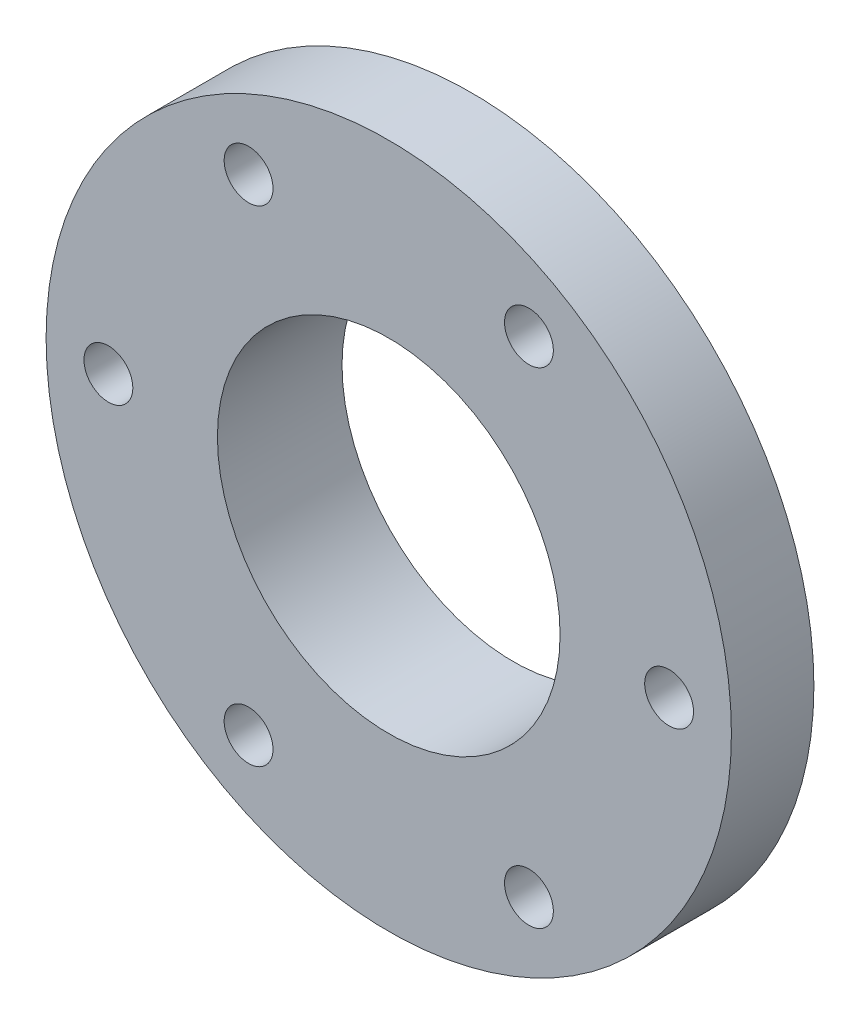
ISO-10303-21;
HEADER;
FILE_DESCRIPTION(('STEP AP214'),'2;1');
FILE_NAME('part.step','',(''),(''),'','','');
FILE_SCHEMA(('AUTOMOTIVE_DESIGN { 1 0 10303 214 1 1 1 1 }'));
ENDSEC;
DATA;
#1=APPLICATION_CONTEXT('core data for automotive mechanical design processes');
#2=APPLICATION_PROTOCOL_DEFINITION('international standard','automotive_design',2000,#1);
#3=PRODUCT_CONTEXT('',#1,'mechanical');
#4=PRODUCT('Part','Part','',(#3));
#5=PRODUCT_RELATED_PRODUCT_CATEGORY('part','',(#4));
#6=PRODUCT_DEFINITION_FORMATION('','',#4);
#7=PRODUCT_DEFINITION_CONTEXT('part definition',#1,'design');
#8=PRODUCT_DEFINITION('design','',#6,#7);
#9=PRODUCT_DEFINITION_SHAPE('','',#8);
#10=(LENGTH_UNIT() NAMED_UNIT(*) SI_UNIT(.MILLI.,.METRE.));
#11=(NAMED_UNIT(*) PLANE_ANGLE_UNIT() SI_UNIT($,.RADIAN.));
#12=(NAMED_UNIT(*) SI_UNIT($,.STERADIAN.) SOLID_ANGLE_UNIT());
#13=UNCERTAINTY_MEASURE_WITH_UNIT(LENGTH_MEASURE(1.E-05),#10,'distance_accuracy_value','');
#14=(GEOMETRIC_REPRESENTATION_CONTEXT(3) GLOBAL_UNCERTAINTY_ASSIGNED_CONTEXT((#13)) GLOBAL_UNIT_ASSIGNED_CONTEXT((#10,
#11,#12)) REPRESENTATION_CONTEXT('',''));
#15=CARTESIAN_POINT('',(0.,0.,0.));
#16=DIRECTION('',(0.,0.,1.));
#17=DIRECTION('',(1.,0.,0.));
#18=AXIS2_PLACEMENT_3D('',#15,#16,#17);
#19=CARTESIAN_POINT('',(0.,0.,-4.2037));
#20=DIRECTION('',(0.,0.,1.));
#21=DIRECTION('',(1.,0.,0.));
#22=AXIS2_PLACEMENT_3D('',#19,#20,#21);
#23=PLANE('',#22);
#24=CARTESIAN_POINT('',(14.2875,-24.7466759131404,-4.2037));
#25=DIRECTION('',(0.,0.,1.));
#26=DIRECTION('',(1.,0.,0.));
#27=AXIS2_PLACEMENT_3D('',#24,#25,#26);
#28=CIRCLE('',#27,2.4892);
#29=CARTESIAN_POINT('',(16.7767,-24.7466759131404,-4.2037));
#30=VERTEX_POINT('',#29);
#31=EDGE_CURVE('E83',#30,#30,#28,.T.);
#32=ORIENTED_EDGE('',*,*,#31,.T.);
#33=EDGE_LOOP('',(#32));
#34=FACE_BOUND('',#33,.T.);
#35=CARTESIAN_POINT('',(28.575,0.,-4.2037));
#36=DIRECTION('',(0.,0.,1.));
#37=DIRECTION('',(1.,0.,0.));
#38=AXIS2_PLACEMENT_3D('',#35,#36,#37);
#39=CIRCLE('',#38,2.4892);
#40=CARTESIAN_POINT('',(31.0642,0.,-4.2037));
#41=VERTEX_POINT('',#40);
#42=EDGE_CURVE('E77',#41,#41,#39,.T.);
#43=ORIENTED_EDGE('',*,*,#42,.T.);
#44=EDGE_LOOP('',(#43));
#45=FACE_BOUND('',#44,.T.);
#46=CARTESIAN_POINT('',(14.2875,24.7466759131403,-4.2037));
#47=DIRECTION('',(0.,0.,1.));
#48=DIRECTION('',(1.,0.,0.));
#49=AXIS2_PLACEMENT_3D('',#46,#47,#48);
#50=CIRCLE('',#49,2.4892);
#51=CARTESIAN_POINT('',(16.7767,24.7466759131403,-4.2037));
#52=VERTEX_POINT('',#51);
#53=EDGE_CURVE('E71',#52,#52,#50,.T.);
#54=ORIENTED_EDGE('',*,*,#53,.T.);
#55=EDGE_LOOP('',(#54));
#56=FACE_BOUND('',#55,.T.);
#57=CARTESIAN_POINT('',(-14.2875,24.7466759131403,-4.2037));
#58=DIRECTION('',(0.,0.,1.));
#59=DIRECTION('',(1.,0.,0.));
#60=AXIS2_PLACEMENT_3D('',#57,#58,#59);
#61=CIRCLE('',#60,2.4892);
#62=CARTESIAN_POINT('',(-11.7983,24.7466759131403,-4.2037));
#63=VERTEX_POINT('',#62);
#64=EDGE_CURVE('E65',#63,#63,#61,.T.);
#65=ORIENTED_EDGE('',*,*,#64,.T.);
#66=EDGE_LOOP('',(#65));
#67=FACE_BOUND('',#66,.T.);
#68=CARTESIAN_POINT('',(-28.575,0.,-4.2037));
#69=DIRECTION('',(0.,0.,1.));
#70=DIRECTION('',(1.,0.,0.));
#71=AXIS2_PLACEMENT_3D('',#68,#69,#70);
#72=CIRCLE('',#71,2.4892);
#73=CARTESIAN_POINT('',(-26.0858,0.,-4.2037));
#74=VERTEX_POINT('',#73);
#75=EDGE_CURVE('E59',#74,#74,#72,.T.);
#76=ORIENTED_EDGE('',*,*,#75,.T.);
#77=EDGE_LOOP('',(#76));
#78=FACE_BOUND('',#77,.T.);
#79=CARTESIAN_POINT('',(-14.2875,-24.7466759131403,-4.2037));
#80=DIRECTION('',(0.,0.,1.));
#81=DIRECTION('',(1.,0.,0.));
#82=AXIS2_PLACEMENT_3D('',#79,#80,#81);
#83=CIRCLE('',#82,2.4892);
#84=CARTESIAN_POINT('',(-11.7983,-24.7466759131403,-4.2037));
#85=VERTEX_POINT('',#84);
#86=EDGE_CURVE('E53',#85,#85,#83,.T.);
#87=ORIENTED_EDGE('',*,*,#86,.T.);
#88=EDGE_LOOP('',(#87));
#89=FACE_BOUND('',#88,.T.);
#90=CARTESIAN_POINT('',(0.,0.,-4.2037));
#91=DIRECTION('',(0.,0.,1.));
#92=DIRECTION('',(1.,0.,0.));
#93=AXIS2_PLACEMENT_3D('',#90,#91,#92);
#94=CIRCLE('',#93,34.925);
#95=CARTESIAN_POINT('',(34.925,0.,-4.2037));
#96=VERTEX_POINT('',#95);
#97=EDGE_CURVE('E43',#96,#96,#94,.T.);
#98=ORIENTED_EDGE('',*,*,#97,.F.);
#99=EDGE_LOOP('',(#98));
#100=FACE_BOUND('',#99,.T.);
#101=CARTESIAN_POINT('',(0.,0.,-4.2037));
#102=DIRECTION('',(0.,0.,1.));
#103=DIRECTION('',(1.,0.,0.));
#104=AXIS2_PLACEMENT_3D('',#101,#102,#103);
#105=CIRCLE('',#104,23.8125);
#106=CARTESIAN_POINT('',(23.8125,0.,-4.2037));
#107=VERTEX_POINT('',#106);
#108=EDGE_CURVE('E10',#107,#107,#105,.F.);
#109=ORIENTED_EDGE('',*,*,#108,.F.);
#110=EDGE_LOOP('',(#109));
#111=FACE_BOUND('',#110,.T.);
#112=ADVANCED_FACE('F32',(#34,#45,#56,#67,#78,#89,#100,#111),#23,.F.);
#113=CARTESIAN_POINT('',(0.,0.,4.2037));
#114=DIRECTION('',(0.,0.,1.));
#115=DIRECTION('',(1.,0.,0.));
#116=AXIS2_PLACEMENT_3D('',#113,#114,#115);
#117=PLANE('',#116);
#118=CARTESIAN_POINT('',(0.,0.,4.2037));
#119=DIRECTION('',(0.,0.,1.));
#120=DIRECTION('',(1.,0.,0.));
#121=AXIS2_PLACEMENT_3D('',#118,#119,#120);
#122=CIRCLE('',#121,17.4625);
#123=CARTESIAN_POINT('',(17.4625,0.,4.2037));
#124=VERTEX_POINT('',#123);
#125=EDGE_CURVE('E48',#124,#124,#122,.T.);
#126=ORIENTED_EDGE('',*,*,#125,.F.);
#127=EDGE_LOOP('',(#126));
#128=FACE_BOUND('',#127,.T.);
#129=CARTESIAN_POINT('',(14.2875,-24.7466759131404,4.2037));
#130=DIRECTION('',(0.,0.,1.));
#131=DIRECTION('',(1.,0.,0.));
#132=AXIS2_PLACEMENT_3D('',#129,#130,#131);
#133=CIRCLE('',#132,2.4892);
#134=CARTESIAN_POINT('',(16.7767,-24.7466759131404,4.2037));
#135=VERTEX_POINT('',#134);
#136=EDGE_CURVE('E80',#135,#135,#133,.T.);
#137=ORIENTED_EDGE('',*,*,#136,.F.);
#138=EDGE_LOOP('',(#137));
#139=FACE_BOUND('',#138,.T.);
#140=CARTESIAN_POINT('',(14.2875,24.7466759131403,4.2037));
#141=DIRECTION('',(0.,0.,1.));
#142=DIRECTION('',(1.,0.,0.));
#143=AXIS2_PLACEMENT_3D('',#140,#141,#142);
#144=CIRCLE('',#143,2.4892);
#145=CARTESIAN_POINT('',(16.7767,24.7466759131403,4.2037));
#146=VERTEX_POINT('',#145);
#147=EDGE_CURVE('E68',#146,#146,#144,.T.);
#148=ORIENTED_EDGE('',*,*,#147,.F.);
#149=EDGE_LOOP('',(#148));
#150=FACE_BOUND('',#149,.T.);
#151=CARTESIAN_POINT('',(-28.575,0.,4.2037));
#152=DIRECTION('',(0.,0.,1.));
#153=DIRECTION('',(1.,0.,0.));
#154=AXIS2_PLACEMENT_3D('',#151,#152,#153);
#155=CIRCLE('',#154,2.4892);
#156=CARTESIAN_POINT('',(-26.0858,0.,4.2037));
#157=VERTEX_POINT('',#156);
#158=EDGE_CURVE('E56',#157,#157,#155,.T.);
#159=ORIENTED_EDGE('',*,*,#158,.F.);
#160=EDGE_LOOP('',(#159));
#161=FACE_BOUND('',#160,.T.);
#162=CARTESIAN_POINT('',(0.,0.,4.2037));
#163=DIRECTION('',(0.,0.,1.));
#164=DIRECTION('',(1.,0.,0.));
#165=AXIS2_PLACEMENT_3D('',#162,#163,#164);
#166=CIRCLE('',#165,34.925);
#167=CARTESIAN_POINT('',(34.925,0.,4.2037));
#168=VERTEX_POINT('',#167);
#169=EDGE_CURVE('E39',#168,#168,#166,.T.);
#170=ORIENTED_EDGE('',*,*,#169,.T.);
#171=EDGE_LOOP('',(#170));
#172=FACE_BOUND('',#171,.T.);
#173=CARTESIAN_POINT('',(-14.2875,-24.7466759131403,4.2037));
#174=DIRECTION('',(0.,0.,1.));
#175=DIRECTION('',(1.,0.,0.));
#176=AXIS2_PLACEMENT_3D('',#173,#174,#175);
#177=CIRCLE('',#176,2.4892);
#178=CARTESIAN_POINT('',(-11.7983,-24.7466759131403,4.2037));
#179=VERTEX_POINT('',#178);
#180=EDGE_CURVE('E52',#179,#179,#177,.T.);
#181=ORIENTED_EDGE('',*,*,#180,.F.);
#182=EDGE_LOOP('',(#181));
#183=FACE_BOUND('',#182,.T.);
#184=CARTESIAN_POINT('',(-14.2875,24.7466759131403,4.2037));
#185=DIRECTION('',(0.,0.,1.));
#186=DIRECTION('',(1.,0.,0.));
#187=AXIS2_PLACEMENT_3D('',#184,#185,#186);
#188=CIRCLE('',#187,2.4892);
#189=CARTESIAN_POINT('',(-11.7983,24.7466759131403,4.2037));
#190=VERTEX_POINT('',#189);
#191=EDGE_CURVE('E62',#190,#190,#188,.T.);
#192=ORIENTED_EDGE('',*,*,#191,.F.);
#193=EDGE_LOOP('',(#192));
#194=FACE_BOUND('',#193,.T.);
#195=CARTESIAN_POINT('',(28.575,0.,4.2037));
#196=DIRECTION('',(0.,0.,1.));
#197=DIRECTION('',(1.,0.,0.));
#198=AXIS2_PLACEMENT_3D('',#195,#196,#197);
#199=CIRCLE('',#198,2.4892);
#200=CARTESIAN_POINT('',(31.0642,0.,4.2037));
#201=VERTEX_POINT('',#200);
#202=EDGE_CURVE('E74',#201,#201,#199,.T.);
#203=ORIENTED_EDGE('',*,*,#202,.F.);
#204=EDGE_LOOP('',(#203));
#205=FACE_BOUND('',#204,.T.);
#206=ADVANCED_FACE('F109',(#128,#139,#150,#161,#172,#183,#194,#205),#117,.T.);
#207=CARTESIAN_POINT('',(0.,0.,4.2037));
#208=DIRECTION('',(0.,0.,-1.));
#209=DIRECTION('',(-1.,0.,0.));
#210=AXIS2_PLACEMENT_3D('',#207,#208,#209);
#211=CYLINDRICAL_SURFACE('',#210,34.925);
#212=ORIENTED_EDGE('',*,*,#169,.F.);
#213=EDGE_LOOP('',(#212));
#214=FACE_BOUND('',#213,.T.);
#215=ORIENTED_EDGE('',*,*,#97,.T.);
#216=EDGE_LOOP('',(#215));
#217=FACE_BOUND('',#216,.T.);
#218=ADVANCED_FACE('F34',(#214,#217),#211,.T.);
#219=CARTESIAN_POINT('',(0.,0.,4.2037));
#220=DIRECTION('',(0.,0.,-1.));
#221=DIRECTION('',(-1.,0.,0.));
#222=AXIS2_PLACEMENT_3D('',#219,#220,#221);
#223=CYLINDRICAL_SURFACE('',#222,17.4625);
#224=ORIENTED_EDGE('',*,*,#125,.T.);
#225=EDGE_LOOP('',(#224));
#226=FACE_BOUND('',#225,.T.);
#227=CARTESIAN_POINT('',(0.,0.,-8.4963));
#228=DIRECTION('',(0.,0.,-1.));
#229=DIRECTION('',(-1.,0.,0.));
#230=AXIS2_PLACEMENT_3D('',#227,#228,#229);
#231=CIRCLE('',#230,17.4625);
#232=CARTESIAN_POINT('',(-17.4625,0.,-8.4963));
#233=VERTEX_POINT('',#232);
#234=EDGE_CURVE('E91',#233,#233,#231,.T.);
#235=ORIENTED_EDGE('',*,*,#234,.T.);
#236=EDGE_LOOP('',(#235));
#237=FACE_BOUND('',#236,.T.);
#238=ADVANCED_FACE('F95',(#226,#237),#223,.F.);
#239=CARTESIAN_POINT('',(-14.2875,-24.7466759131403,4.2037));
#240=DIRECTION('',(0.,0.,-1.));
#241=DIRECTION('',(-1.,0.,0.));
#242=AXIS2_PLACEMENT_3D('',#239,#240,#241);
#243=CYLINDRICAL_SURFACE('',#242,2.4892);
#244=ORIENTED_EDGE('',*,*,#180,.T.);
#245=EDGE_LOOP('',(#244));
#246=FACE_BOUND('',#245,.T.);
#247=ORIENTED_EDGE('',*,*,#86,.F.);
#248=EDGE_LOOP('',(#247));
#249=FACE_BOUND('',#248,.T.);
#250=ADVANCED_FACE('F120',(#246,#249),#243,.F.);
#251=CARTESIAN_POINT('',(-28.575,0.,4.2037));
#252=DIRECTION('',(0.,0.,-1.));
#253=DIRECTION('',(-1.,0.,0.));
#254=AXIS2_PLACEMENT_3D('',#251,#252,#253);
#255=CYLINDRICAL_SURFACE('',#254,2.4892);
#256=ORIENTED_EDGE('',*,*,#158,.T.);
#257=EDGE_LOOP('',(#256));
#258=FACE_BOUND('',#257,.T.);
#259=ORIENTED_EDGE('',*,*,#75,.F.);
#260=EDGE_LOOP('',(#259));
#261=FACE_BOUND('',#260,.T.);
#262=ADVANCED_FACE('F124',(#258,#261),#255,.F.);
#263=CARTESIAN_POINT('',(-14.2875,24.7466759131403,4.2037));
#264=DIRECTION('',(0.,0.,-1.));
#265=DIRECTION('',(-1.,0.,0.));
#266=AXIS2_PLACEMENT_3D('',#263,#264,#265);
#267=CYLINDRICAL_SURFACE('',#266,2.4892);
#268=ORIENTED_EDGE('',*,*,#191,.T.);
#269=EDGE_LOOP('',(#268));
#270=FACE_BOUND('',#269,.T.);
#271=ORIENTED_EDGE('',*,*,#64,.F.);
#272=EDGE_LOOP('',(#271));
#273=FACE_BOUND('',#272,.T.);
#274=ADVANCED_FACE('F128',(#270,#273),#267,.F.);
#275=CARTESIAN_POINT('',(14.2875,24.7466759131403,4.2037));
#276=DIRECTION('',(0.,0.,-1.));
#277=DIRECTION('',(-1.,0.,0.));
#278=AXIS2_PLACEMENT_3D('',#275,#276,#277);
#279=CYLINDRICAL_SURFACE('',#278,2.4892);
#280=ORIENTED_EDGE('',*,*,#147,.T.);
#281=EDGE_LOOP('',(#280));
#282=FACE_BOUND('',#281,.T.);
#283=ORIENTED_EDGE('',*,*,#53,.F.);
#284=EDGE_LOOP('',(#283));
#285=FACE_BOUND('',#284,.T.);
#286=ADVANCED_FACE('F132',(#282,#285),#279,.F.);
#287=CARTESIAN_POINT('',(28.575,0.,4.2037));
#288=DIRECTION('',(0.,0.,-1.));
#289=DIRECTION('',(-1.,0.,0.));
#290=AXIS2_PLACEMENT_3D('',#287,#288,#289);
#291=CYLINDRICAL_SURFACE('',#290,2.4892);
#292=ORIENTED_EDGE('',*,*,#202,.T.);
#293=EDGE_LOOP('',(#292));
#294=FACE_BOUND('',#293,.T.);
#295=ORIENTED_EDGE('',*,*,#42,.F.);
#296=EDGE_LOOP('',(#295));
#297=FACE_BOUND('',#296,.T.);
#298=ADVANCED_FACE('F136',(#294,#297),#291,.F.);
#299=CARTESIAN_POINT('',(14.2875,-24.7466759131404,4.2037));
#300=DIRECTION('',(0.,0.,-1.));
#301=DIRECTION('',(-1.,0.,0.));
#302=AXIS2_PLACEMENT_3D('',#299,#300,#301);
#303=CYLINDRICAL_SURFACE('',#302,2.4892);
#304=ORIENTED_EDGE('',*,*,#136,.T.);
#305=EDGE_LOOP('',(#304));
#306=FACE_BOUND('',#305,.T.);
#307=ORIENTED_EDGE('',*,*,#31,.F.);
#308=EDGE_LOOP('',(#307));
#309=FACE_BOUND('',#308,.T.);
#310=ADVANCED_FACE('F105',(#306,#309),#303,.F.);
#311=CARTESIAN_POINT('',(0.,0.,-8.4963));
#312=DIRECTION('',(0.,0.,1.));
#313=DIRECTION('',(1.,0.,0.));
#314=AXIS2_PLACEMENT_3D('',#311,#312,#313);
#315=CYLINDRICAL_SURFACE('',#314,23.8125);
#316=CARTESIAN_POINT('',(0.,0.,-8.4963));
#317=DIRECTION('',(0.,0.,-1.));
#318=DIRECTION('',(-1.,0.,0.));
#319=AXIS2_PLACEMENT_3D('',#316,#317,#318);
#320=CIRCLE('',#319,23.8125);
#321=CARTESIAN_POINT('',(-23.8125,0.,-8.4963));
#322=VERTEX_POINT('',#321);
#323=EDGE_CURVE('E86',#322,#322,#320,.T.);
#324=ORIENTED_EDGE('',*,*,#323,.F.);
#325=EDGE_LOOP('',(#324));
#326=FACE_BOUND('',#325,.T.);
#327=ORIENTED_EDGE('',*,*,#108,.T.);
#328=EDGE_LOOP('',(#327));
#329=FACE_BOUND('',#328,.T.);
#330=ADVANCED_FACE('F99',(#326,#329),#315,.T.);
#331=CARTESIAN_POINT('',(0.,0.,-8.4963));
#332=DIRECTION('',(0.,0.,-1.));
#333=DIRECTION('',(-1.,0.,0.));
#334=AXIS2_PLACEMENT_3D('',#331,#332,#333);
#335=PLANE('',#334);
#336=ORIENTED_EDGE('',*,*,#323,.T.);
#337=EDGE_LOOP('',(#336));
#338=FACE_BOUND('',#337,.T.);
#339=ORIENTED_EDGE('',*,*,#234,.F.);
#340=EDGE_LOOP('',(#339));
#341=FACE_BOUND('',#340,.T.);
#342=ADVANCED_FACE('F97',(#338,#341),#335,.T.);
#343=CLOSED_SHELL('',(#112,#206,#218,#238,#250,#262,#274,#286,#298,#310,#330,#342));
#344=MANIFOLD_SOLID_BREP('B2',#343);
#345=ADVANCED_BREP_SHAPE_REPRESENTATION('',(#18,#344),#14);
#346=SHAPE_DEFINITION_REPRESENTATION(#9,#345);
ENDSEC;
END-ISO-10303-21;
